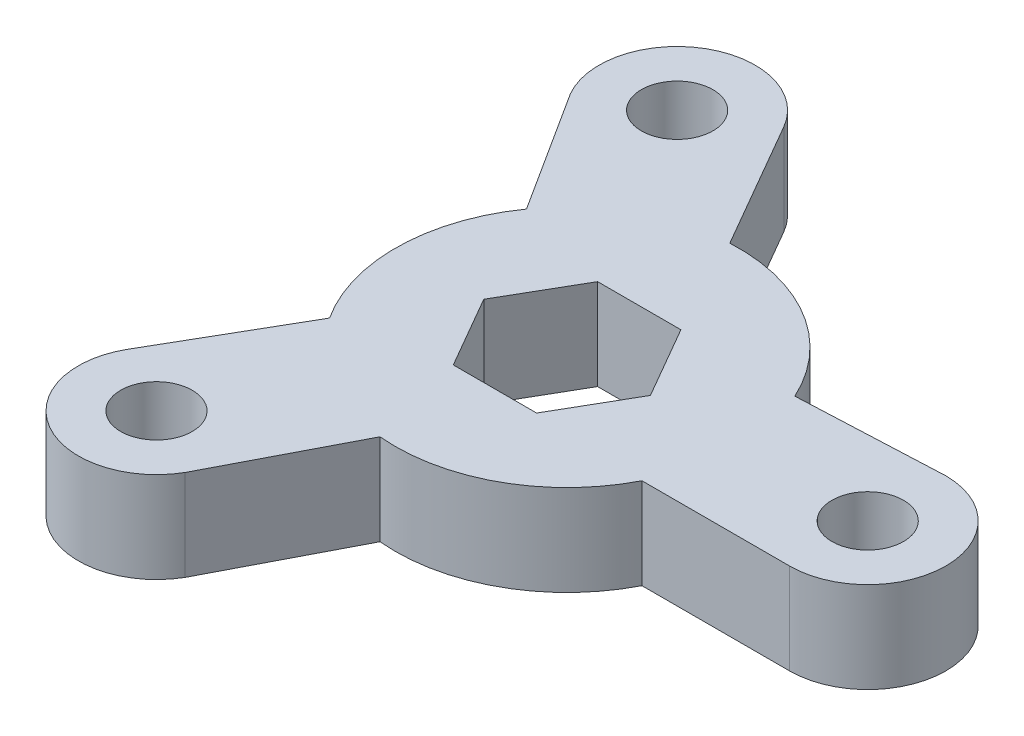
ISO-10303-21;
HEADER;
FILE_DESCRIPTION(('STEP AP214'),'2;1');
FILE_NAME('part.step','',(''),(''),'','','');
FILE_SCHEMA(('AUTOMOTIVE_DESIGN { 1 0 10303 214 1 1 1 1 }'));
ENDSEC;
DATA;
#1=APPLICATION_CONTEXT('core data for automotive mechanical design processes');
#2=APPLICATION_PROTOCOL_DEFINITION('international standard','automotive_design',2000,#1);
#3=PRODUCT_CONTEXT('',#1,'mechanical');
#4=PRODUCT('Part','Part','',(#3));
#5=PRODUCT_RELATED_PRODUCT_CATEGORY('part','',(#4));
#6=PRODUCT_DEFINITION_FORMATION('','',#4);
#7=PRODUCT_DEFINITION_CONTEXT('part definition',#1,'design');
#8=PRODUCT_DEFINITION('design','',#6,#7);
#9=PRODUCT_DEFINITION_SHAPE('','',#8);
#10=(LENGTH_UNIT() NAMED_UNIT(*) SI_UNIT(.MILLI.,.METRE.));
#11=(NAMED_UNIT(*) PLANE_ANGLE_UNIT() SI_UNIT($,.RADIAN.));
#12=(NAMED_UNIT(*) SI_UNIT($,.STERADIAN.) SOLID_ANGLE_UNIT());
#13=UNCERTAINTY_MEASURE_WITH_UNIT(LENGTH_MEASURE(1.E-05),#10,'distance_accuracy_value','');
#14=(GEOMETRIC_REPRESENTATION_CONTEXT(3) GLOBAL_UNCERTAINTY_ASSIGNED_CONTEXT((#13)) GLOBAL_UNIT_ASSIGNED_CONTEXT((#10,
#11,#12)) REPRESENTATION_CONTEXT('',''));
#15=CARTESIAN_POINT('',(0.,0.,0.));
#16=DIRECTION('',(0.,0.,1.));
#17=DIRECTION('',(1.,0.,0.));
#18=AXIS2_PLACEMENT_3D('',#15,#16,#17);
#19=CARTESIAN_POINT('',(4.17441800564484,3.175,-2.41010135926907));
#20=DIRECTION('',(-0.866025403784439,0.,0.5));
#21=DIRECTION('',(0.5,0.,0.866025403784439));
#22=AXIS2_PLACEMENT_3D('',#19,#20,#21);
#23=PLANE('',#22);
#24=DIRECTION('',(-0.5,0.,-0.866025403784439));
#25=VECTOR('',#24,1.);
#26=CARTESIAN_POINT('',(4.17441800564484,0.,-2.41010135926907));
#27=LINE('',#26,#25);
#28=CARTESIAN_POINT('',(5.42460739841125,0.,-0.244709811913956));
#29=VERTEX_POINT('',#28);
#30=CARTESIAN_POINT('',(3.96968472005387,0.,-2.76470981191314));
#31=VERTEX_POINT('',#30);
#32=EDGE_CURVE('E244',#29,#31,#27,.T.);
#33=ORIENTED_EDGE('',*,*,#32,.F.);
#34=DIRECTION('',(0.,-1.,0.));
#35=VECTOR('',#34,1.);
#36=CARTESIAN_POINT('',(5.42460739841125,3.175,-0.244709811913956));
#37=LINE('',#36,#35);
#38=CARTESIAN_POINT('',(5.42460739841125,3.175,-0.244709811913956));
#39=VERTEX_POINT('',#38);
#40=EDGE_CURVE('E11',#39,#29,#37,.T.);
#41=ORIENTED_EDGE('',*,*,#40,.F.);
#42=DIRECTION('',(-0.5,0.,-0.866025403784439));
#43=VECTOR('',#42,1.);
#44=CARTESIAN_POINT('',(4.17441800564484,3.175,-2.41010135926907));
#45=LINE('',#44,#43);
#46=CARTESIAN_POINT('',(3.96968472005387,3.175,-2.76470981191314));
#47=VERTEX_POINT('',#46);
#48=EDGE_CURVE('E345',#39,#47,#45,.T.);
#49=ORIENTED_EDGE('',*,*,#48,.T.);
#50=DIRECTION('',(0.,-1.,0.));
#51=VECTOR('',#50,1.);
#52=CARTESIAN_POINT('',(3.96968472005387,3.175,-2.76470981191314));
#53=LINE('',#52,#51);
#54=EDGE_CURVE('E60',#47,#31,#53,.T.);
#55=ORIENTED_EDGE('',*,*,#54,.T.);
#56=EDGE_LOOP('',(#33,#41,#49,#55));
#57=FACE_BOUND('',#56,.T.);
#58=ADVANCED_FACE('F41',(#57),#23,.T.);
#59=CARTESIAN_POINT('',(3.96249309197275,3.175,2.2877464533125));
#60=DIRECTION('',(-0.866025403784439,0.,-0.5));
#61=DIRECTION('',(-0.5,0.,0.866025403784439));
#62=AXIS2_PLACEMENT_3D('',#59,#60,#61);
#63=PLANE('',#62);
#64=DIRECTION('',(0.5,0.,-0.866025403784439));
#65=VECTOR('',#64,1.);
#66=CARTESIAN_POINT('',(3.96249309197275,0.,2.2877464533125));
#67=LINE('',#66,#65);
#68=CARTESIAN_POINT('',(3.96968472005387,0.,2.27529018808686));
#69=VERTEX_POINT('',#68);
#70=EDGE_CURVE('E246',#69,#29,#67,.T.);
#71=ORIENTED_EDGE('',*,*,#70,.F.);
#72=DIRECTION('',(0.,-1.,0.));
#73=VECTOR('',#72,1.);
#74=CARTESIAN_POINT('',(3.96968472005387,3.175,2.27529018808686));
#75=LINE('',#74,#73);
#76=CARTESIAN_POINT('',(3.96968472005387,3.175,2.27529018808686));
#77=VERTEX_POINT('',#76);
#78=EDGE_CURVE('E51',#77,#69,#75,.T.);
#79=ORIENTED_EDGE('',*,*,#78,.F.);
#80=DIRECTION('',(0.5,0.,-0.866025403784439));
#81=VECTOR('',#80,1.);
#82=CARTESIAN_POINT('',(3.96249309197275,3.175,2.2877464533125));
#83=LINE('',#82,#81);
#84=EDGE_CURVE('E347',#77,#39,#83,.T.);
#85=ORIENTED_EDGE('',*,*,#84,.T.);
#86=ORIENTED_EDGE('',*,*,#40,.T.);
#87=EDGE_LOOP('',(#71,#79,#85,#86));
#88=FACE_BOUND('',#87,.T.);
#89=ADVANCED_FACE('F371',(#88),#63,.T.);
#90=CARTESIAN_POINT('',(0.,3.175,2.27529018808686));
#91=DIRECTION('',(0.,0.,-1.));
#92=DIRECTION('',(-1.,0.,0.));
#93=AXIS2_PLACEMENT_3D('',#90,#91,#92);
#94=PLANE('',#93);
#95=DIRECTION('',(1.,0.,0.));
#96=VECTOR('',#95,1.);
#97=CARTESIAN_POINT('',(0.,0.,2.27529018808686));
#98=LINE('',#97,#96);
#99=CARTESIAN_POINT('',(1.05983936333941,0.,2.27529018808903));
#100=VERTEX_POINT('',#99);
#101=EDGE_CURVE('E249',#100,#69,#98,.T.);
#102=ORIENTED_EDGE('',*,*,#101,.F.);
#103=DIRECTION('',(0.,-1.,0.));
#104=VECTOR('',#103,1.);
#105=CARTESIAN_POINT('',(1.05983936333941,3.175,2.27529018808903));
#106=LINE('',#105,#104);
#107=CARTESIAN_POINT('',(1.05983936333941,3.175,2.27529018808903));
#108=VERTEX_POINT('',#107);
#109=EDGE_CURVE('E183',#108,#100,#106,.T.);
#110=ORIENTED_EDGE('',*,*,#109,.F.);
#111=DIRECTION('',(1.,0.,0.));
#112=VECTOR('',#111,1.);
#113=CARTESIAN_POINT('',(0.,3.175,2.27529018808686));
#114=LINE('',#113,#112);
#115=EDGE_CURVE('E195',#108,#77,#114,.T.);
#116=ORIENTED_EDGE('',*,*,#115,.T.);
#117=ORIENTED_EDGE('',*,*,#78,.T.);
#118=EDGE_LOOP('',(#102,#110,#116,#117));
#119=FACE_BOUND('',#118,.T.);
#120=ADVANCED_FACE('F351',(#119),#94,.T.);
#121=CARTESIAN_POINT('',(-0.190350029428729,3.175,0.10989864073093));
#122=DIRECTION('',(0.866025403784439,0.,-0.5));
#123=DIRECTION('',(-0.5,0.,-0.866025403784439));
#124=AXIS2_PLACEMENT_3D('',#121,#122,#123);
#125=PLANE('',#124);
#126=DIRECTION('',(0.5,0.,0.866025403784439));
#127=VECTOR('',#126,1.);
#128=CARTESIAN_POINT('',(-0.190350029428729,0.,0.10989864073093));
#129=LINE('',#128,#127);
#130=CARTESIAN_POINT('',(-0.395083315019698,0.,-0.244709811913138));
#131=VERTEX_POINT('',#130);
#132=EDGE_CURVE('E179',#131,#100,#129,.T.);
#133=ORIENTED_EDGE('',*,*,#132,.F.);
#134=DIRECTION('',(0.,-1.,0.));
#135=VECTOR('',#134,1.);
#136=CARTESIAN_POINT('',(-0.395083315019698,3.175,-0.244709811913138));
#137=LINE('',#136,#135);
#138=CARTESIAN_POINT('',(-0.395083315019698,3.175,-0.244709811913138));
#139=VERTEX_POINT('',#138);
#140=EDGE_CURVE('E174',#139,#131,#137,.T.);
#141=ORIENTED_EDGE('',*,*,#140,.F.);
#142=DIRECTION('',(0.5,0.,0.866025403784439));
#143=VECTOR('',#142,1.);
#144=CARTESIAN_POINT('',(-0.190350029428729,3.175,0.10989864073093));
#145=LINE('',#144,#143);
#146=EDGE_CURVE('E177',#139,#108,#145,.T.);
#147=ORIENTED_EDGE('',*,*,#146,.T.);
#148=ORIENTED_EDGE('',*,*,#109,.T.);
#149=EDGE_LOOP('',(#133,#141,#147,#148));
#150=FACE_BOUND('',#149,.T.);
#151=ADVANCED_FACE('F176',(#150),#125,.T.);
#152=CARTESIAN_POINT('',(-0.402274943100818,3.175,-0.232253546687499));
#153=DIRECTION('',(0.866025403784439,0.,0.5));
#154=DIRECTION('',(0.5,0.,-0.866025403784439));
#155=AXIS2_PLACEMENT_3D('',#152,#153,#154);
#156=PLANE('',#155);
#157=DIRECTION('',(-0.5,0.,0.866025403784439));
#158=VECTOR('',#157,1.);
#159=CARTESIAN_POINT('',(-0.402274943100818,0.,-0.232253546687499));
#160=LINE('',#159,#158);
#161=CARTESIAN_POINT('',(1.05983936334065,0.,-2.76470981191314));
#162=VERTEX_POINT('',#161);
#163=EDGE_CURVE('E253',#162,#131,#160,.T.);
#164=ORIENTED_EDGE('',*,*,#163,.F.);
#165=DIRECTION('',(0.,-1.,0.));
#166=VECTOR('',#165,1.);
#167=CARTESIAN_POINT('',(1.05983936334065,3.175,-2.76470981191314));
#168=LINE('',#167,#166);
#169=CARTESIAN_POINT('',(1.05983936334065,3.175,-2.76470981191314));
#170=VERTEX_POINT('',#169);
#171=EDGE_CURVE('E115',#170,#162,#168,.T.);
#172=ORIENTED_EDGE('',*,*,#171,.F.);
#173=DIRECTION('',(-0.5,0.,0.866025403784439));
#174=VECTOR('',#173,1.);
#175=CARTESIAN_POINT('',(-0.402274943100818,3.175,-0.232253546687499));
#176=LINE('',#175,#174);
#177=EDGE_CURVE('E192',#170,#139,#176,.T.);
#178=ORIENTED_EDGE('',*,*,#177,.T.);
#179=ORIENTED_EDGE('',*,*,#140,.T.);
#180=EDGE_LOOP('',(#164,#172,#178,#179));
#181=FACE_BOUND('',#180,.T.);
#182=ADVANCED_FACE('F197',(#181),#156,.T.);
#183=CARTESIAN_POINT('',(3.87987291900672,3.175,2.01140464348408));
#184=DIRECTION('',(-0.887790184262467,0.,-0.460248398940414));
#185=DIRECTION('',(-0.460248398940414,0.,0.887790184262467));
#186=AXIS2_PLACEMENT_3D('',#183,#184,#185);
#187=PLANE('',#186);
#188=DIRECTION('',(0.460248398940414,0.,-0.887790184262467));
#189=VECTOR('',#188,1.);
#190=CARTESIAN_POINT('',(3.87987291900672,0.,2.01140464348408));
#191=LINE('',#190,#189);
#192=CARTESIAN_POINT('',(-0.371989304252298,0.,10.2129791744026));
#193=VERTEX_POINT('',#192);
#194=CARTESIAN_POINT('',(1.95264752249876,0.,5.72890109500738));
#195=VERTEX_POINT('',#194);
#196=EDGE_CURVE('E213',#193,#195,#191,.T.);
#197=ORIENTED_EDGE('',*,*,#196,.T.);
#198=DIRECTION('',(0.,-1.,0.));
#199=VECTOR('',#198,1.);
#200=CARTESIAN_POINT('',(1.95264752249876,3.175,5.72890109500738));
#201=LINE('',#200,#199);
#202=CARTESIAN_POINT('',(1.95264752249876,3.175,5.72890109500738));
#203=VERTEX_POINT('',#202);
#204=EDGE_CURVE('E45',#203,#195,#201,.T.);
#205=ORIENTED_EDGE('',*,*,#204,.F.);
#206=DIRECTION('',(0.460248398940414,0.,-0.887790184262467));
#207=VECTOR('',#206,1.);
#208=CARTESIAN_POINT('',(3.87987291900672,3.175,2.01140464348408));
#209=LINE('',#208,#207);
#210=CARTESIAN_POINT('',(-0.371989304252298,3.175,10.2129791744026));
#211=VERTEX_POINT('',#210);
#212=EDGE_CURVE('E267',#211,#203,#209,.T.);
#213=ORIENTED_EDGE('',*,*,#212,.F.);
#214=DIRECTION('',(0.,-1.,0.));
#215=VECTOR('',#214,1.);
#216=CARTESIAN_POINT('',(-0.371989304252298,3.175,10.2129791744026));
#217=LINE('',#216,#215);
#218=EDGE_CURVE('E212',#211,#193,#217,.T.);
#219=ORIENTED_EDGE('',*,*,#218,.T.);
#220=EDGE_LOOP('',(#197,#205,#213,#219));
#221=FACE_BOUND('',#220,.T.);
#222=ADVANCED_FACE('F43',(#221),#187,.F.);
#223=CARTESIAN_POINT('',(2.51476204169899,3.175,-0.244709811913956));
#224=DIRECTION('',(0.,-1.,0.));
#225=DIRECTION('',(0.,0.,-1.));
#226=AXIS2_PLACEMENT_3D('',#223,#224,#225);
#227=CYLINDRICAL_SURFACE('',#226,5.99999999999654);
#228=CARTESIAN_POINT('',(2.51476204169899,0.,-0.244709811913956));
#229=DIRECTION('',(0.,1.,0.));
#230=DIRECTION('',(0.,0.,1.));
#231=AXIS2_PLACEMENT_3D('',#228,#229,#230);
#232=CIRCLE('',#231,5.99999999999654);
#233=CARTESIAN_POINT('',(7.85830091889641,0.,2.48413468124451));
#234=VERTEX_POINT('',#233);
#235=EDGE_CURVE('E216',#195,#234,#232,.T.);
#236=ORIENTED_EDGE('',*,*,#235,.T.);
#237=DIRECTION('',(0.,-1.,0.));
#238=VECTOR('',#237,1.);
#239=CARTESIAN_POINT('',(7.85830091889641,3.175,2.48413468124451));
#240=LINE('',#239,#238);
#241=CARTESIAN_POINT('',(7.85830091889641,3.175,2.48413468124451));
#242=VERTEX_POINT('',#241);
#243=EDGE_CURVE('E295',#242,#234,#240,.T.);
#244=ORIENTED_EDGE('',*,*,#243,.F.);
#245=CARTESIAN_POINT('',(2.51476204169899,3.175,-0.244709811913956));
#246=DIRECTION('',(0.,1.,0.));
#247=DIRECTION('',(0.,0.,1.));
#248=AXIS2_PLACEMENT_3D('',#245,#246,#247);
#249=CIRCLE('',#248,5.99999999999654);
#250=EDGE_CURVE('E128',#203,#242,#249,.T.);
#251=ORIENTED_EDGE('',*,*,#250,.F.);
#252=ORIENTED_EDGE('',*,*,#204,.T.);
#253=EDGE_LOOP('',(#236,#244,#251,#252));
#254=FACE_BOUND('',#253,.T.);
#255=ADVANCED_FACE('F300',(#254),#227,.T.);
#256=CARTESIAN_POINT('',(0.,3.175,2.48413468124462));
#257=DIRECTION('',(0.,0.,1.));
#258=DIRECTION('',(1.,0.,0.));
#259=AXIS2_PLACEMENT_3D('',#256,#257,#258);
#260=PLANE('',#259);
#261=DIRECTION('',(-1.,0.,0.));
#262=VECTOR('',#261,1.);
#263=CARTESIAN_POINT('',(0.,0.,2.48413468124462));
#264=LINE('',#263,#262);
#265=CARTESIAN_POINT('',(13.0147620416956,0.,2.48413468124462));
#266=VERTEX_POINT('',#265);
#267=EDGE_CURVE('E219',#266,#234,#264,.T.);
#268=ORIENTED_EDGE('',*,*,#267,.F.);
#269=DIRECTION('',(0.,-1.,0.));
#270=VECTOR('',#269,1.);
#271=CARTESIAN_POINT('',(13.0147620416956,3.175,2.48413468124462));
#272=LINE('',#271,#270);
#273=CARTESIAN_POINT('',(13.0147620416956,3.175,2.48413468124462));
#274=VERTEX_POINT('',#273);
#275=EDGE_CURVE('E294',#274,#266,#272,.T.);
#276=ORIENTED_EDGE('',*,*,#275,.F.);
#277=DIRECTION('',(-1.,0.,0.));
#278=VECTOR('',#277,1.);
#279=CARTESIAN_POINT('',(0.,3.175,2.48413468124462));
#280=LINE('',#279,#278);
#281=EDGE_CURVE('E315',#274,#242,#280,.T.);
#282=ORIENTED_EDGE('',*,*,#281,.T.);
#283=ORIENTED_EDGE('',*,*,#243,.T.);
#284=EDGE_LOOP('',(#268,#276,#282,#283));
#285=FACE_BOUND('',#284,.T.);
#286=ADVANCED_FACE('F312',(#285),#260,.T.);
#287=CARTESIAN_POINT('',(13.0147620416956,3.175,-0.244709811913141));
#288=DIRECTION('',(0.,-1.,0.));
#289=DIRECTION('',(0.,0.,-1.));
#290=AXIS2_PLACEMENT_3D('',#287,#288,#289);
#291=CYLINDRICAL_SURFACE('',#290,2.72884449315776);
#292=CARTESIAN_POINT('',(13.0147620416956,0.,-0.244709811913141));
#293=DIRECTION('',(0.,1.,0.));
#294=DIRECTION('',(0.,0.,1.));
#295=AXIS2_PLACEMENT_3D('',#292,#293,#294);
#296=CIRCLE('',#295,2.72884449315776);
#297=CARTESIAN_POINT('',(13.0147620416966,0.,-2.97355430507091));
#298=VERTEX_POINT('',#297);
#299=EDGE_CURVE('E222',#266,#298,#296,.T.);
#300=ORIENTED_EDGE('',*,*,#299,.T.);
#301=DIRECTION('',(0.,-1.,0.));
#302=VECTOR('',#301,1.);
#303=CARTESIAN_POINT('',(13.0147620416966,3.175,-2.97355430507091));
#304=LINE('',#303,#302);
#305=CARTESIAN_POINT('',(13.0147620416966,3.175,-2.97355430507091));
#306=VERTEX_POINT('',#305);
#307=EDGE_CURVE('E291',#306,#298,#304,.T.);
#308=ORIENTED_EDGE('',*,*,#307,.F.);
#309=CARTESIAN_POINT('',(13.0147620416956,3.175,-0.244709811913141));
#310=DIRECTION('',(0.,1.,0.));
#311=DIRECTION('',(0.,0.,1.));
#312=AXIS2_PLACEMENT_3D('',#309,#310,#311);
#313=CIRCLE('',#312,2.72884449315776);
#314=EDGE_CURVE('E318',#274,#306,#313,.T.);
#315=ORIENTED_EDGE('',*,*,#314,.F.);
#316=ORIENTED_EDGE('',*,*,#275,.T.);
#317=EDGE_LOOP('',(#300,#308,#315,#316));
#318=FACE_BOUND('',#317,.T.);
#319=ADVANCED_FACE('F319',(#318),#291,.T.);
#320=CARTESIAN_POINT('',(-0.107871058470792,3.175,-2.37837906979592));
#321=DIRECTION('',(0.045308286597738,0.,0.998973052271971));
#322=DIRECTION('',(0.998973052271971,0.,-0.045308286597738));
#323=AXIS2_PLACEMENT_3D('',#320,#321,#322);
#324=PLANE('',#323);
#325=DIRECTION('',(-0.998973052271971,0.,0.045308286597738));
#326=VECTOR('',#325,1.);
#327=CARTESIAN_POINT('',(-0.107871058470792,0.,-2.37837906979592));
#328=LINE('',#327,#326);
#329=CARTESIAN_POINT('',(7.96911809901363,0.,-2.74470981191327));
#330=VERTEX_POINT('',#329);
#331=EDGE_CURVE('E224',#298,#330,#328,.T.);
#332=ORIENTED_EDGE('',*,*,#331,.T.);
#333=DIRECTION('',(0.,-1.,0.));
#334=VECTOR('',#333,1.);
#335=CARTESIAN_POINT('',(7.96911809901363,3.175,-2.74470981191327));
#336=LINE('',#335,#334);
#337=CARTESIAN_POINT('',(7.96911809901363,3.175,-2.74470981191327));
#338=VERTEX_POINT('',#337);
#339=EDGE_CURVE('E288',#338,#330,#336,.T.);
#340=ORIENTED_EDGE('',*,*,#339,.F.);
#341=DIRECTION('',(-0.998973052271971,0.,0.045308286597738));
#342=VECTOR('',#341,1.);
#343=CARTESIAN_POINT('',(-0.107871058470792,3.175,-2.37837906979592));
#344=LINE('',#343,#342);
#345=EDGE_CURVE('E322',#306,#338,#344,.T.);
#346=ORIENTED_EDGE('',*,*,#345,.F.);
#347=ORIENTED_EDGE('',*,*,#307,.T.);
#348=EDGE_LOOP('',(#332,#340,#346,#347));
#349=FACE_BOUND('',#348,.T.);
#350=ADVANCED_FACE('F403',(#349),#324,.F.);
#351=CARTESIAN_POINT('',(2.51476204169899,3.175,-0.244709811913956));
#352=DIRECTION('',(0.,-1.,0.));
#353=DIRECTION('',(0.,0.,-1.));
#354=AXIS2_PLACEMENT_3D('',#351,#352,#353);
#355=CYLINDRICAL_SURFACE('',#354,5.99999999999654);
#356=CARTESIAN_POINT('',(2.51476204169899,0.,-0.244709811913956));
#357=DIRECTION('',(0.,1.,0.));
#358=DIRECTION('',(0.,0.,1.));
#359=AXIS2_PLACEMENT_3D('',#356,#357,#358);
#360=CIRCLE('',#359,5.99999999999654);
#361=CARTESIAN_POINT('',(2.20624125714765,0.,-6.23677247225647));
#362=VERTEX_POINT('',#361);
#363=EDGE_CURVE('E226',#330,#362,#360,.T.);
#364=ORIENTED_EDGE('',*,*,#363,.T.);
#365=DIRECTION('',(0.,-1.,0.));
#366=VECTOR('',#365,1.);
#367=CARTESIAN_POINT('',(2.20624125714765,3.175,-6.23677247225647));
#368=LINE('',#367,#366);
#369=CARTESIAN_POINT('',(2.20624125714765,3.175,-6.23677247225647));
#370=VERTEX_POINT('',#369);
#371=EDGE_CURVE('E286',#370,#362,#368,.T.);
#372=ORIENTED_EDGE('',*,*,#371,.F.);
#373=CARTESIAN_POINT('',(2.51476204169899,3.175,-0.244709811913956));
#374=DIRECTION('',(0.,1.,0.));
#375=DIRECTION('',(0.,0.,1.));
#376=AXIS2_PLACEMENT_3D('',#373,#374,#375);
#377=CIRCLE('',#376,5.99999999999654);
#378=EDGE_CURVE('E329',#338,#370,#377,.T.);
#379=ORIENTED_EDGE('',*,*,#378,.F.);
#380=ORIENTED_EDGE('',*,*,#339,.T.);
#381=EDGE_LOOP('',(#364,#372,#379,#380));
#382=FACE_BOUND('',#381,.T.);
#383=ADVANCED_FACE('F399',(#382),#355,.T.);
#384=CARTESIAN_POINT('',(4.35528264215995,3.175,-2.51452360584794));
#385=DIRECTION('',(0.866025403784439,0.,-0.499999999999999));
#386=DIRECTION('',(-0.499999999999999,0.,-0.866025403784439));
#387=AXIS2_PLACEMENT_3D('',#384,#385,#386);
#388=PLANE('',#387);
#389=DIRECTION('',(0.499999999999999,0.,0.866025403784439));
#390=VECTOR('',#389,1.);
#391=CARTESIAN_POINT('',(4.35528264215995,0.,-2.51452360584794));
#392=LINE('',#391,#390);
#393=CARTESIAN_POINT('',(-0.371989304251888,0.,-10.7023987982283));
#394=VERTEX_POINT('',#393);
#395=EDGE_CURVE('E229',#394,#362,#392,.T.);
#396=ORIENTED_EDGE('',*,*,#395,.F.);
#397=DIRECTION('',(0.,-1.,0.));
#398=VECTOR('',#397,1.);
#399=CARTESIAN_POINT('',(-0.371989304251888,3.175,-10.7023987982283));
#400=LINE('',#399,#398);
#401=CARTESIAN_POINT('',(-0.371989304251888,3.175,-10.7023987982283));
#402=VERTEX_POINT('',#401);
#403=EDGE_CURVE('E284',#402,#394,#400,.T.);
#404=ORIENTED_EDGE('',*,*,#403,.F.);
#405=DIRECTION('',(0.499999999999999,0.,0.866025403784439));
#406=VECTOR('',#405,1.);
#407=CARTESIAN_POINT('',(4.35528264215995,3.175,-2.51452360584794));
#408=LINE('',#407,#406);
#409=EDGE_CURVE('E331',#402,#370,#408,.T.);
#410=ORIENTED_EDGE('',*,*,#409,.T.);
#411=ORIENTED_EDGE('',*,*,#371,.T.);
#412=EDGE_LOOP('',(#396,#404,#410,#411));
#413=FACE_BOUND('',#412,.T.);
#414=ADVANCED_FACE('F395',(#413),#388,.T.);
#415=CARTESIAN_POINT('',(-2.73523795830378,3.175,-9.3379765516494));
#416=DIRECTION('',(0.,-1.,0.));
#417=DIRECTION('',(0.,0.,-1.));
#418=AXIS2_PLACEMENT_3D('',#415,#416,#417);
#419=CYLINDRICAL_SURFACE('',#418,2.72884449315776);
#420=CARTESIAN_POINT('',(-2.73523795830378,0.,-9.3379765516494));
#421=DIRECTION('',(0.,1.,0.));
#422=DIRECTION('',(0.,0.,1.));
#423=AXIS2_PLACEMENT_3D('',#420,#421,#422);
#424=CIRCLE('',#423,2.72884449315776);
#425=CARTESIAN_POINT('',(-5.09848661235614,0.,-7.97355430507133));
#426=VERTEX_POINT('',#425);
#427=EDGE_CURVE('E232',#394,#426,#424,.T.);
#428=ORIENTED_EDGE('',*,*,#427,.T.);
#429=DIRECTION('',(0.,-1.,0.));
#430=VECTOR('',#429,1.);
#431=CARTESIAN_POINT('',(-5.09848661235614,3.175,-7.97355430507133));
#432=LINE('',#431,#430);
#433=CARTESIAN_POINT('',(-5.09848661235614,3.175,-7.97355430507133));
#434=VERTEX_POINT('',#433);
#435=EDGE_CURVE('E281',#434,#426,#432,.T.);
#436=ORIENTED_EDGE('',*,*,#435,.F.);
#437=CARTESIAN_POINT('',(-2.73523795830378,3.175,-9.3379765516494));
#438=DIRECTION('',(0.,1.,0.));
#439=DIRECTION('',(0.,0.,1.));
#440=AXIS2_PLACEMENT_3D('',#437,#438,#439);
#441=CIRCLE('',#440,2.72884449315776);
#442=EDGE_CURVE('E334',#402,#434,#441,.T.);
#443=ORIENTED_EDGE('',*,*,#442,.F.);
#444=ORIENTED_EDGE('',*,*,#403,.T.);
#445=EDGE_LOOP('',(#428,#436,#443,#444));
#446=FACE_BOUND('',#445,.T.);
#447=ADVANCED_FACE('F391',(#446),#419,.T.);
#448=CARTESIAN_POINT('',(0.000141202008173699,3.175,-9.02915577342994E-05));
#449=DIRECTION('',(0.842481897664738,0.,-0.538724653331571));
#450=DIRECTION('',(-0.538724653331571,0.,-0.842481897664738));
#451=AXIS2_PLACEMENT_3D('',#448,#449,#450);
#452=PLANE('',#451);
#453=DIRECTION('',(0.538724653331571,0.,0.842481897664738));
#454=VECTOR('',#453,1.);
#455=CARTESIAN_POINT('',(0.000141202008173699,0.,-9.02915577342994E-05));
#456=LINE('',#455,#454);
#457=CARTESIAN_POINT('',(-2.37747949642197,0.,-3.71832071883421));
#458=VERTEX_POINT('',#457);
#459=EDGE_CURVE('E234',#426,#458,#456,.T.);
#460=ORIENTED_EDGE('',*,*,#459,.T.);
#461=DIRECTION('',(0.,-1.,0.));
#462=VECTOR('',#461,1.);
#463=CARTESIAN_POINT('',(-2.37747949642197,3.175,-3.71832071883421));
#464=LINE('',#463,#462);
#465=CARTESIAN_POINT('',(-2.37747949642197,3.175,-3.71832071883421));
#466=VERTEX_POINT('',#465);
#467=EDGE_CURVE('E278',#466,#458,#464,.T.);
#468=ORIENTED_EDGE('',*,*,#467,.F.);
#469=DIRECTION('',(0.538724653331571,0.,0.842481897664738));
#470=VECTOR('',#469,1.);
#471=CARTESIAN_POINT('',(0.000141202008173699,3.175,-9.02915577342994E-05));
#472=LINE('',#471,#470);
#473=EDGE_CURVE('E336',#434,#466,#472,.T.);
#474=ORIENTED_EDGE('',*,*,#473,.F.);
#475=ORIENTED_EDGE('',*,*,#435,.T.);
#476=EDGE_LOOP('',(#460,#468,#474,#475));
#477=FACE_BOUND('',#476,.T.);
#478=ADVANCED_FACE('F387',(#477),#452,.F.);
#479=CARTESIAN_POINT('',(2.51476204169899,3.175,-0.244709811913956));
#480=DIRECTION('',(0.,-1.,0.));
#481=DIRECTION('',(0.,0.,-1.));
#482=AXIS2_PLACEMENT_3D('',#479,#480,#481);
#483=CYLINDRICAL_SURFACE('',#482,5.99999999999654);
#484=CARTESIAN_POINT('',(2.51476204169899,0.,-0.244709811913956));
#485=DIRECTION('',(0.,1.,0.));
#486=DIRECTION('',(0.,0.,1.));
#487=AXIS2_PLACEMENT_3D('',#484,#485,#486);
#488=CIRCLE('',#487,5.99999999999654);
#489=CARTESIAN_POINT('',(-2.5202560509539,0.,3.01850835527196));
#490=VERTEX_POINT('',#489);
#491=EDGE_CURVE('E236',#458,#490,#488,.T.);
#492=ORIENTED_EDGE('',*,*,#491,.T.);
#493=DIRECTION('',(0.,-1.,0.));
#494=VECTOR('',#493,1.);
#495=CARTESIAN_POINT('',(-2.5202560509539,3.175,3.01850835527196));
#496=LINE('',#495,#494);
#497=CARTESIAN_POINT('',(-2.5202560509539,3.175,3.01850835527196));
#498=VERTEX_POINT('',#497);
#499=EDGE_CURVE('E276',#498,#490,#496,.T.);
#500=ORIENTED_EDGE('',*,*,#499,.F.);
#501=CARTESIAN_POINT('',(2.51476204169899,3.175,-0.244709811913956));
#502=DIRECTION('',(0.,1.,0.));
#503=DIRECTION('',(0.,0.,1.));
#504=AXIS2_PLACEMENT_3D('',#501,#502,#503);
#505=CIRCLE('',#504,5.99999999999654);
#506=EDGE_CURVE('E338',#466,#498,#505,.T.);
#507=ORIENTED_EDGE('',*,*,#506,.F.);
#508=ORIENTED_EDGE('',*,*,#467,.T.);
#509=EDGE_LOOP('',(#492,#500,#507,#508));
#510=FACE_BOUND('',#509,.T.);
#511=ADVANCED_FACE('F383',(#510),#483,.T.);
#512=CARTESIAN_POINT('',(-0.583139579616138,3.175,-0.336675793266482));
#513=DIRECTION('',(-0.866025403784452,0.,-0.499999999999977));
#514=DIRECTION('',(-0.499999999999977,0.,0.866025403784452));
#515=AXIS2_PLACEMENT_3D('',#512,#513,#514);
#516=PLANE('',#515);
#517=DIRECTION('',(0.499999999999977,0.,-0.866025403784452));
#518=VECTOR('',#517,1.);
#519=CARTESIAN_POINT('',(-0.583139579616138,0.,-0.336675793266482));
#520=LINE('',#519,#518);
#521=CARTESIAN_POINT('',(-5.09848661235567,0.,7.48413468124424));
#522=VERTEX_POINT('',#521);
#523=EDGE_CURVE('E239',#522,#490,#520,.T.);
#524=ORIENTED_EDGE('',*,*,#523,.F.);
#525=DIRECTION('',(0.,-1.,0.));
#526=VECTOR('',#525,1.);
#527=CARTESIAN_POINT('',(-5.09848661235567,3.175,7.48413468124424));
#528=LINE('',#527,#526);
#529=CARTESIAN_POINT('',(-5.09848661235567,3.175,7.48413468124424));
#530=VERTEX_POINT('',#529);
#531=EDGE_CURVE('E274',#530,#522,#528,.T.);
#532=ORIENTED_EDGE('',*,*,#531,.F.);
#533=DIRECTION('',(0.499999999999977,0.,-0.866025403784452));
#534=VECTOR('',#533,1.);
#535=CARTESIAN_POINT('',(-0.583139579616138,3.175,-0.336675793266482));
#536=LINE('',#535,#534);
#537=EDGE_CURVE('E340',#530,#498,#536,.T.);
#538=ORIENTED_EDGE('',*,*,#537,.T.);
#539=ORIENTED_EDGE('',*,*,#499,.T.);
#540=EDGE_LOOP('',(#524,#532,#538,#539));
#541=FACE_BOUND('',#540,.T.);
#542=ADVANCED_FACE('F380',(#541),#516,.T.);
#543=CARTESIAN_POINT('',(13.014762041699,3.175,-0.244709811913956));
#544=DIRECTION('',(0.,-1.,0.));
#545=DIRECTION('',(0.,0.,-1.));
#546=AXIS2_PLACEMENT_3D('',#543,#544,#545);
#547=CYLINDRICAL_SURFACE('',#546,1.24999999999653);
#548=CARTESIAN_POINT('',(13.014762041699,3.175,-0.244709811913956));
#549=DIRECTION('',(0.,1.,0.));
#550=DIRECTION('',(0.,0.,1.));
#551=AXIS2_PLACEMENT_3D('',#548,#549,#550);
#552=CIRCLE('',#551,1.24999999999653);
#553=CARTESIAN_POINT('',(13.014762041699,3.175,1.00529018808258));
#554=VERTEX_POINT('',#553);
#555=EDGE_CURVE('E206',#554,#554,#552,.T.);
#556=ORIENTED_EDGE('',*,*,#555,.T.);
#557=EDGE_LOOP('',(#556));
#558=FACE_BOUND('',#557,.T.);
#559=CARTESIAN_POINT('',(13.014762041699,0.,-0.244709811913956));
#560=DIRECTION('',(0.,1.,0.));
#561=DIRECTION('',(0.,0.,1.));
#562=AXIS2_PLACEMENT_3D('',#559,#560,#561);
#563=CIRCLE('',#562,1.24999999999653);
#564=CARTESIAN_POINT('',(13.014762041699,0.,1.00529018808258));
#565=VERTEX_POINT('',#564);
#566=EDGE_CURVE('E261',#565,#565,#563,.T.);
#567=ORIENTED_EDGE('',*,*,#566,.F.);
#568=EDGE_LOOP('',(#567));
#569=FACE_BOUND('',#568,.T.);
#570=ADVANCED_FACE('F366',(#558,#569),#547,.F.);
#571=CARTESIAN_POINT('',(-2.73523795830378,3.175,-9.3379765516494));
#572=DIRECTION('',(0.,-1.,0.));
#573=DIRECTION('',(0.,0.,-1.));
#574=AXIS2_PLACEMENT_3D('',#571,#572,#573);
#575=CYLINDRICAL_SURFACE('',#574,1.24999999999961);
#576=CARTESIAN_POINT('',(-2.73523795830378,3.175,-9.3379765516494));
#577=DIRECTION('',(0.,1.,0.));
#578=DIRECTION('',(0.,0.,1.));
#579=AXIS2_PLACEMENT_3D('',#576,#577,#578);
#580=CIRCLE('',#579,1.24999999999961);
#581=CARTESIAN_POINT('',(-2.73523795830378,3.175,-8.08797655164979));
#582=VERTEX_POINT('',#581);
#583=EDGE_CURVE('E200',#582,#582,#580,.T.);
#584=ORIENTED_EDGE('',*,*,#583,.T.);
#585=EDGE_LOOP('',(#584));
#586=FACE_BOUND('',#585,.T.);
#587=CARTESIAN_POINT('',(-2.73523795830378,0.,-9.3379765516494));
#588=DIRECTION('',(0.,1.,0.));
#589=DIRECTION('',(0.,0.,1.));
#590=AXIS2_PLACEMENT_3D('',#587,#588,#589);
#591=CIRCLE('',#590,1.24999999999961);
#592=CARTESIAN_POINT('',(-2.73523795830378,0.,-8.08797655164979));
#593=VERTEX_POINT('',#592);
#594=EDGE_CURVE('E258',#593,#593,#591,.T.);
#595=ORIENTED_EDGE('',*,*,#594,.F.);
#596=EDGE_LOOP('',(#595));
#597=FACE_BOUND('',#596,.T.);
#598=ADVANCED_FACE('F357',(#586,#597),#575,.F.);
#599=CARTESIAN_POINT('',(0.,3.175,-2.76470981191314));
#600=DIRECTION('',(0.,0.,1.));
#601=DIRECTION('',(1.,0.,0.));
#602=AXIS2_PLACEMENT_3D('',#599,#600,#601);
#603=PLANE('',#602);
#604=DIRECTION('',(-1.,0.,0.));
#605=VECTOR('',#604,1.);
#606=CARTESIAN_POINT('',(0.,0.,-2.76470981191314));
#607=LINE('',#606,#605);
#608=EDGE_CURVE('E255',#31,#162,#607,.T.);
#609=ORIENTED_EDGE('',*,*,#608,.F.);
#610=ORIENTED_EDGE('',*,*,#54,.F.);
#611=DIRECTION('',(-1.,0.,0.));
#612=VECTOR('',#611,1.);
#613=CARTESIAN_POINT('',(0.,3.175,-2.76470981191314));
#614=LINE('',#613,#612);
#615=EDGE_CURVE('E198',#47,#170,#614,.T.);
#616=ORIENTED_EDGE('',*,*,#615,.T.);
#617=ORIENTED_EDGE('',*,*,#171,.T.);
#618=EDGE_LOOP('',(#609,#610,#616,#617));
#619=FACE_BOUND('',#618,.T.);
#620=ADVANCED_FACE('F354',(#619),#603,.T.);
#621=CARTESIAN_POINT('',(-2.73523795830378,3.175,8.84855692782312));
#622=DIRECTION('',(0.,-1.,0.));
#623=DIRECTION('',(0.,0.,-1.));
#624=AXIS2_PLACEMENT_3D('',#621,#622,#623);
#625=CYLINDRICAL_SURFACE('',#624,2.72884449315774);
#626=CARTESIAN_POINT('',(-2.73523795830378,0.,8.84855692782312));
#627=DIRECTION('',(0.,1.,0.));
#628=DIRECTION('',(0.,0.,1.));
#629=AXIS2_PLACEMENT_3D('',#626,#627,#628);
#630=CIRCLE('',#629,2.72884449315774);
#631=EDGE_CURVE('E242',#522,#193,#630,.T.);
#632=ORIENTED_EDGE('',*,*,#631,.T.);
#633=ORIENTED_EDGE('',*,*,#218,.F.);
#634=CARTESIAN_POINT('',(-2.73523795830378,3.175,8.84855692782312));
#635=DIRECTION('',(0.,1.,0.));
#636=DIRECTION('',(0.,0.,1.));
#637=AXIS2_PLACEMENT_3D('',#634,#635,#636);
#638=CIRCLE('',#637,2.72884449315774);
#639=EDGE_CURVE('E343',#530,#211,#638,.T.);
#640=ORIENTED_EDGE('',*,*,#639,.F.);
#641=ORIENTED_EDGE('',*,*,#531,.T.);
#642=EDGE_LOOP('',(#632,#633,#640,#641));
#643=FACE_BOUND('',#642,.T.);
#644=ADVANCED_FACE('F356',(#643),#625,.T.);
#645=CARTESIAN_POINT('',(-2.73523795830101,3.175,8.84855692782265));
#646=DIRECTION('',(0.,-1.,0.));
#647=DIRECTION('',(0.,0.,-1.));
#648=AXIS2_PLACEMENT_3D('',#645,#646,#647);
#649=CYLINDRICAL_SURFACE('',#648,1.2499999999965);
#650=CARTESIAN_POINT('',(-2.73523795830101,3.175,8.84855692782265));
#651=DIRECTION('',(0.,1.,0.));
#652=DIRECTION('',(0.,0.,1.));
#653=AXIS2_PLACEMENT_3D('',#650,#651,#652);
#654=CIRCLE('',#653,1.2499999999965);
#655=CARTESIAN_POINT('',(-2.73523795830101,3.175,10.0985569278192));
#656=VERTEX_POINT('',#655);
#657=EDGE_CURVE('E209',#656,#656,#654,.T.);
#658=ORIENTED_EDGE('',*,*,#657,.T.);
#659=EDGE_LOOP('',(#658));
#660=FACE_BOUND('',#659,.T.);
#661=CARTESIAN_POINT('',(-2.73523795830101,0.,8.84855692782265));
#662=DIRECTION('',(0.,1.,0.));
#663=DIRECTION('',(0.,0.,1.));
#664=AXIS2_PLACEMENT_3D('',#661,#662,#663);
#665=CIRCLE('',#664,1.2499999999965);
#666=CARTESIAN_POINT('',(-2.73523795830101,0.,10.0985569278192));
#667=VERTEX_POINT('',#666);
#668=EDGE_CURVE('E264',#667,#667,#665,.T.);
#669=ORIENTED_EDGE('',*,*,#668,.F.);
#670=EDGE_LOOP('',(#669));
#671=FACE_BOUND('',#670,.T.);
#672=ADVANCED_FACE('F363',(#660,#671),#649,.F.);
#673=CARTESIAN_POINT('',(0.,3.175,0.));
#674=DIRECTION('',(0.,1.,0.));
#675=DIRECTION('',(0.,0.,1.));
#676=AXIS2_PLACEMENT_3D('',#673,#674,#675);
#677=PLANE('',#676);
#678=ORIENTED_EDGE('',*,*,#212,.T.);
#679=ORIENTED_EDGE('',*,*,#250,.T.);
#680=ORIENTED_EDGE('',*,*,#281,.F.);
#681=ORIENTED_EDGE('',*,*,#314,.T.);
#682=ORIENTED_EDGE('',*,*,#345,.T.);
#683=ORIENTED_EDGE('',*,*,#378,.T.);
#684=ORIENTED_EDGE('',*,*,#409,.F.);
#685=ORIENTED_EDGE('',*,*,#442,.T.);
#686=ORIENTED_EDGE('',*,*,#473,.T.);
#687=ORIENTED_EDGE('',*,*,#506,.T.);
#688=ORIENTED_EDGE('',*,*,#537,.F.);
#689=ORIENTED_EDGE('',*,*,#639,.T.);
#690=EDGE_LOOP('',(#678,#679,#680,#681,#682,#683,#684,#685,#686,#687,#688,#689));
#691=FACE_BOUND('',#690,.T.);
#692=ORIENTED_EDGE('',*,*,#48,.F.);
#693=ORIENTED_EDGE('',*,*,#84,.F.);
#694=ORIENTED_EDGE('',*,*,#115,.F.);
#695=ORIENTED_EDGE('',*,*,#146,.F.);
#696=ORIENTED_EDGE('',*,*,#177,.F.);
#697=ORIENTED_EDGE('',*,*,#615,.F.);
#698=EDGE_LOOP('',(#692,#693,#694,#695,#696,#697));
#699=FACE_BOUND('',#698,.T.);
#700=ORIENTED_EDGE('',*,*,#583,.F.);
#701=EDGE_LOOP('',(#700));
#702=FACE_BOUND('',#701,.T.);
#703=ORIENTED_EDGE('',*,*,#555,.F.);
#704=EDGE_LOOP('',(#703));
#705=FACE_BOUND('',#704,.T.);
#706=ORIENTED_EDGE('',*,*,#657,.F.);
#707=EDGE_LOOP('',(#706));
#708=FACE_BOUND('',#707,.T.);
#709=ADVANCED_FACE('F189',(#691,#699,#702,#705,#708),#677,.T.);
#710=CARTESIAN_POINT('',(0.,0.,0.));
#711=DIRECTION('',(0.,1.,0.));
#712=DIRECTION('',(0.,0.,1.));
#713=AXIS2_PLACEMENT_3D('',#710,#711,#712);
#714=PLANE('',#713);
#715=ORIENTED_EDGE('',*,*,#196,.F.);
#716=ORIENTED_EDGE('',*,*,#631,.F.);
#717=ORIENTED_EDGE('',*,*,#523,.T.);
#718=ORIENTED_EDGE('',*,*,#491,.F.);
#719=ORIENTED_EDGE('',*,*,#459,.F.);
#720=ORIENTED_EDGE('',*,*,#427,.F.);
#721=ORIENTED_EDGE('',*,*,#395,.T.);
#722=ORIENTED_EDGE('',*,*,#363,.F.);
#723=ORIENTED_EDGE('',*,*,#331,.F.);
#724=ORIENTED_EDGE('',*,*,#299,.F.);
#725=ORIENTED_EDGE('',*,*,#267,.T.);
#726=ORIENTED_EDGE('',*,*,#235,.F.);
#727=EDGE_LOOP('',(#715,#716,#717,#718,#719,#720,#721,#722,#723,#724,#725,#726));
#728=FACE_BOUND('',#727,.T.);
#729=ORIENTED_EDGE('',*,*,#32,.T.);
#730=ORIENTED_EDGE('',*,*,#608,.T.);
#731=ORIENTED_EDGE('',*,*,#163,.T.);
#732=ORIENTED_EDGE('',*,*,#132,.T.);
#733=ORIENTED_EDGE('',*,*,#101,.T.);
#734=ORIENTED_EDGE('',*,*,#70,.T.);
#735=EDGE_LOOP('',(#729,#730,#731,#732,#733,#734));
#736=FACE_BOUND('',#735,.T.);
#737=ORIENTED_EDGE('',*,*,#594,.T.);
#738=EDGE_LOOP('',(#737));
#739=FACE_BOUND('',#738,.T.);
#740=ORIENTED_EDGE('',*,*,#566,.T.);
#741=EDGE_LOOP('',(#740));
#742=FACE_BOUND('',#741,.T.);
#743=ORIENTED_EDGE('',*,*,#668,.T.);
#744=EDGE_LOOP('',(#743));
#745=FACE_BOUND('',#744,.T.);
#746=ADVANCED_FACE('F307',(#728,#736,#739,#742,#745),#714,.F.);
#747=CLOSED_SHELL('',(#58,#89,#120,#151,#182,#222,#255,#286,#319,#350,#383,#414,#447,#478,#511,
#542,#570,#598,#620,#644,#672,#709,#746));
#748=MANIFOLD_SOLID_BREP('B2',#747);
#749=ADVANCED_BREP_SHAPE_REPRESENTATION('',(#18,#748),#14);
#750=SHAPE_DEFINITION_REPRESENTATION(#9,#749);
ENDSEC;
END-ISO-10303-21;
